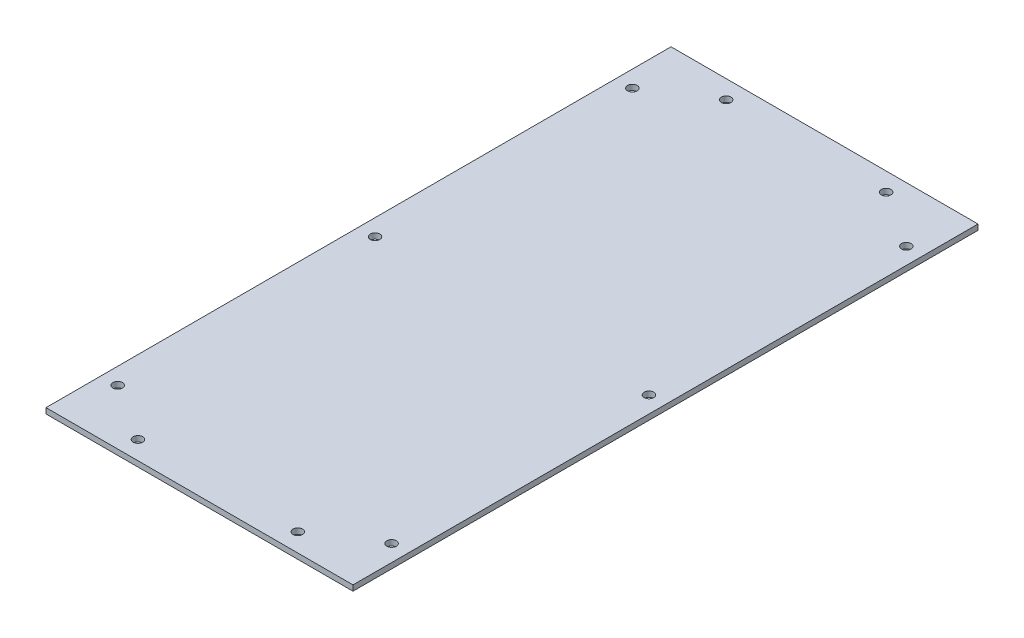
ISO-10303-21;
HEADER;
FILE_DESCRIPTION(('STEP AP214'),'2;1');
FILE_NAME('part.step','',(''),(''),'','','');
FILE_SCHEMA(('AUTOMOTIVE_DESIGN { 1 0 10303 214 1 1 1 1 }'));
ENDSEC;
DATA;
#1=APPLICATION_CONTEXT('core data for automotive mechanical design processes');
#2=APPLICATION_PROTOCOL_DEFINITION('international standard','automotive_design',2000,#1);
#3=PRODUCT_CONTEXT('',#1,'mechanical');
#4=PRODUCT('Part','Part','',(#3));
#5=PRODUCT_RELATED_PRODUCT_CATEGORY('part','',(#4));
#6=PRODUCT_DEFINITION_FORMATION('','',#4);
#7=PRODUCT_DEFINITION_CONTEXT('part definition',#1,'design');
#8=PRODUCT_DEFINITION('design','',#6,#7);
#9=PRODUCT_DEFINITION_SHAPE('','',#8);
#10=(LENGTH_UNIT() NAMED_UNIT(*) SI_UNIT(.MILLI.,.METRE.));
#11=(NAMED_UNIT(*) PLANE_ANGLE_UNIT() SI_UNIT($,.RADIAN.));
#12=(NAMED_UNIT(*) SI_UNIT($,.STERADIAN.) SOLID_ANGLE_UNIT());
#13=UNCERTAINTY_MEASURE_WITH_UNIT(LENGTH_MEASURE(1.E-05),#10,'distance_accuracy_value','');
#14=(GEOMETRIC_REPRESENTATION_CONTEXT(3) GLOBAL_UNCERTAINTY_ASSIGNED_CONTEXT((#13)) GLOBAL_UNIT_ASSIGNED_CONTEXT((#10,
#11,#12)) REPRESENTATION_CONTEXT('',''));
#15=CARTESIAN_POINT('',(0.,0.,0.));
#16=DIRECTION('',(0.,0.,1.));
#17=DIRECTION('',(1.,0.,0.));
#18=AXIS2_PLACEMENT_3D('',#15,#16,#17);
#19=CARTESIAN_POINT('',(0.,3.,0.));
#20=DIRECTION('',(0.,1.,0.));
#21=DIRECTION('',(0.,0.,1.));
#22=AXIS2_PLACEMENT_3D('',#19,#20,#21);
#23=PLANE('',#22);
#24=CARTESIAN_POINT('',(-43.5,3.,160.));
#25=DIRECTION('',(0.,1.,0.));
#26=DIRECTION('',(0.,0.,1.));
#27=AXIS2_PLACEMENT_3D('',#24,#25,#26);
#28=CIRCLE('',#27,2.59999999999998);
#29=CARTESIAN_POINT('',(-43.5,3.,162.6));
#30=VERTEX_POINT('',#29);
#31=EDGE_CURVE('E161',#30,#30,#28,.T.);
#32=ORIENTED_EDGE('',*,*,#31,.F.);
#33=EDGE_LOOP('',(#32));
#34=FACE_BOUND('',#33,.T.);
#35=CARTESIAN_POINT('',(-43.5,3.,-160.));
#36=DIRECTION('',(0.,1.,0.));
#37=DIRECTION('',(0.,0.,1.));
#38=AXIS2_PLACEMENT_3D('',#35,#36,#37);
#39=CIRCLE('',#38,2.59999999999997);
#40=CARTESIAN_POINT('',(-43.5,3.,-157.4));
#41=VERTEX_POINT('',#40);
#42=EDGE_CURVE('E149',#41,#41,#39,.T.);
#43=ORIENTED_EDGE('',*,*,#42,.F.);
#44=EDGE_LOOP('',(#43));
#45=FACE_BOUND('',#44,.T.);
#46=CARTESIAN_POINT('',(74.5000000000001,3.,0.));
#47=DIRECTION('',(0.,1.,0.));
#48=DIRECTION('',(0.,0.,1.));
#49=AXIS2_PLACEMENT_3D('',#46,#47,#48);
#50=CIRCLE('',#49,2.6);
#51=CARTESIAN_POINT('',(74.5000000000001,3.,2.6));
#52=VERTEX_POINT('',#51);
#53=EDGE_CURVE('E137',#52,#52,#50,.T.);
#54=ORIENTED_EDGE('',*,*,#53,.F.);
#55=EDGE_LOOP('',(#54));
#56=FACE_BOUND('',#55,.T.);
#57=CARTESIAN_POINT('',(-74.5,3.,140.));
#58=DIRECTION('',(0.,1.,0.));
#59=DIRECTION('',(0.,0.,1.));
#60=AXIS2_PLACEMENT_3D('',#57,#58,#59);
#61=CIRCLE('',#60,2.6);
#62=CARTESIAN_POINT('',(-74.5,3.,142.6));
#63=VERTEX_POINT('',#62);
#64=EDGE_CURVE('E125',#63,#63,#61,.T.);
#65=ORIENTED_EDGE('',*,*,#64,.F.);
#66=EDGE_LOOP('',(#65));
#67=FACE_BOUND('',#66,.T.);
#68=CARTESIAN_POINT('',(-74.5000000000001,3.,-140.));
#69=DIRECTION('',(0.,1.,0.));
#70=DIRECTION('',(0.,0.,1.));
#71=AXIS2_PLACEMENT_3D('',#68,#69,#70);
#72=CIRCLE('',#71,2.6);
#73=CARTESIAN_POINT('',(-74.5000000000001,3.,-137.4));
#74=VERTEX_POINT('',#73);
#75=EDGE_CURVE('E104',#74,#74,#72,.T.);
#76=ORIENTED_EDGE('',*,*,#75,.F.);
#77=EDGE_LOOP('',(#76));
#78=FACE_BOUND('',#77,.T.);
#79=DIRECTION('',(0.,0.,1.));
#80=VECTOR('',#79,1.);
#81=CARTESIAN_POINT('',(-83.5,3.,-170.));
#82=LINE('',#81,#80);
#83=CARTESIAN_POINT('',(-83.5,3.,-170.));
#84=VERTEX_POINT('',#83);
#85=CARTESIAN_POINT('',(-83.5,3.,170.));
#86=VERTEX_POINT('',#85);
#87=EDGE_CURVE('E89',#84,#86,#82,.T.);
#88=ORIENTED_EDGE('',*,*,#87,.T.);
#89=DIRECTION('',(1.,0.,0.));
#90=VECTOR('',#89,1.);
#91=CARTESIAN_POINT('',(-83.5,3.,170.));
#92=LINE('',#91,#90);
#93=CARTESIAN_POINT('',(83.5,3.,170.));
#94=VERTEX_POINT('',#93);
#95=EDGE_CURVE('E84',#86,#94,#92,.T.);
#96=ORIENTED_EDGE('',*,*,#95,.T.);
#97=DIRECTION('',(0.,0.,-1.));
#98=VECTOR('',#97,1.);
#99=CARTESIAN_POINT('',(83.5,3.,-170.));
#100=LINE('',#99,#98);
#101=CARTESIAN_POINT('',(83.5,3.,-170.));
#102=VERTEX_POINT('',#101);
#103=EDGE_CURVE('E87',#94,#102,#100,.T.);
#104=ORIENTED_EDGE('',*,*,#103,.T.);
#105=DIRECTION('',(-1.,0.,0.));
#106=VECTOR('',#105,1.);
#107=CARTESIAN_POINT('',(-83.5,3.,-170.));
#108=LINE('',#107,#106);
#109=EDGE_CURVE('E54',#102,#84,#108,.T.);
#110=ORIENTED_EDGE('',*,*,#109,.T.);
#111=EDGE_LOOP('',(#88,#96,#104,#110));
#112=FACE_BOUND('',#111,.T.);
#113=CARTESIAN_POINT('',(-74.5,3.,0.));
#114=DIRECTION('',(0.,1.,0.));
#115=DIRECTION('',(0.,0.,1.));
#116=AXIS2_PLACEMENT_3D('',#113,#114,#115);
#117=CIRCLE('',#116,2.6);
#118=CARTESIAN_POINT('',(-74.5,3.,2.6));
#119=VERTEX_POINT('',#118);
#120=EDGE_CURVE('E119',#119,#119,#117,.T.);
#121=ORIENTED_EDGE('',*,*,#120,.F.);
#122=EDGE_LOOP('',(#121));
#123=FACE_BOUND('',#122,.T.);
#124=CARTESIAN_POINT('',(74.5000000000001,3.,-140.));
#125=DIRECTION('',(0.,1.,0.));
#126=DIRECTION('',(0.,0.,1.));
#127=AXIS2_PLACEMENT_3D('',#124,#125,#126);
#128=CIRCLE('',#127,2.6);
#129=CARTESIAN_POINT('',(74.5000000000001,3.,-137.4));
#130=VERTEX_POINT('',#129);
#131=EDGE_CURVE('E131',#130,#130,#128,.T.);
#132=ORIENTED_EDGE('',*,*,#131,.F.);
#133=EDGE_LOOP('',(#132));
#134=FACE_BOUND('',#133,.T.);
#135=CARTESIAN_POINT('',(74.5000000000001,3.,140.));
#136=DIRECTION('',(0.,1.,0.));
#137=DIRECTION('',(0.,0.,1.));
#138=AXIS2_PLACEMENT_3D('',#135,#136,#137);
#139=CIRCLE('',#138,2.6);
#140=CARTESIAN_POINT('',(74.5000000000001,3.,142.6));
#141=VERTEX_POINT('',#140);
#142=EDGE_CURVE('E143',#141,#141,#139,.T.);
#143=ORIENTED_EDGE('',*,*,#142,.F.);
#144=EDGE_LOOP('',(#143));
#145=FACE_BOUND('',#144,.T.);
#146=CARTESIAN_POINT('',(43.5000000000001,3.,-160.));
#147=DIRECTION('',(0.,1.,0.));
#148=DIRECTION('',(0.,0.,1.));
#149=AXIS2_PLACEMENT_3D('',#146,#147,#148);
#150=CIRCLE('',#149,2.59999999999997);
#151=CARTESIAN_POINT('',(43.5000000000001,3.,-157.4));
#152=VERTEX_POINT('',#151);
#153=EDGE_CURVE('E155',#152,#152,#150,.T.);
#154=ORIENTED_EDGE('',*,*,#153,.F.);
#155=EDGE_LOOP('',(#154));
#156=FACE_BOUND('',#155,.T.);
#157=CARTESIAN_POINT('',(43.5000000000001,3.,160.));
#158=DIRECTION('',(0.,1.,0.));
#159=DIRECTION('',(0.,0.,1.));
#160=AXIS2_PLACEMENT_3D('',#157,#158,#159);
#161=CIRCLE('',#160,2.59999999999997);
#162=CARTESIAN_POINT('',(43.5000000000001,3.,162.6));
#163=VERTEX_POINT('',#162);
#164=EDGE_CURVE('E167',#163,#163,#161,.T.);
#165=ORIENTED_EDGE('',*,*,#164,.F.);
#166=EDGE_LOOP('',(#165));
#167=FACE_BOUND('',#166,.T.);
#168=ADVANCED_FACE('F37',(#34,#45,#56,#67,#78,#112,#123,#134,#145,#156,#167),#23,.T.);
#169=CARTESIAN_POINT('',(0.,0.,0.));
#170=DIRECTION('',(0.,1.,0.));
#171=DIRECTION('',(0.,0.,1.));
#172=AXIS2_PLACEMENT_3D('',#169,#170,#171);
#173=PLANE('',#172);
#174=DIRECTION('',(0.,0.,1.));
#175=VECTOR('',#174,1.);
#176=CARTESIAN_POINT('',(-83.5,0.,-170.));
#177=LINE('',#176,#175);
#178=CARTESIAN_POINT('',(-83.5,0.,-170.));
#179=VERTEX_POINT('',#178);
#180=CARTESIAN_POINT('',(-83.5,0.,170.));
#181=VERTEX_POINT('',#180);
#182=EDGE_CURVE('E101',#179,#181,#177,.T.);
#183=ORIENTED_EDGE('',*,*,#182,.F.);
#184=DIRECTION('',(-1.,0.,0.));
#185=VECTOR('',#184,1.);
#186=CARTESIAN_POINT('',(-83.5,0.,-170.));
#187=LINE('',#186,#185);
#188=CARTESIAN_POINT('',(83.5,0.,-170.));
#189=VERTEX_POINT('',#188);
#190=EDGE_CURVE('E77',#189,#179,#187,.T.);
#191=ORIENTED_EDGE('',*,*,#190,.F.);
#192=DIRECTION('',(0.,0.,-1.));
#193=VECTOR('',#192,1.);
#194=CARTESIAN_POINT('',(83.5,0.,-170.));
#195=LINE('',#194,#193);
#196=CARTESIAN_POINT('',(83.5,0.,170.));
#197=VERTEX_POINT('',#196);
#198=EDGE_CURVE('E71',#197,#189,#195,.T.);
#199=ORIENTED_EDGE('',*,*,#198,.F.);
#200=DIRECTION('',(1.,0.,0.));
#201=VECTOR('',#200,1.);
#202=CARTESIAN_POINT('',(-83.5,0.,170.));
#203=LINE('',#202,#201);
#204=EDGE_CURVE('E93',#181,#197,#203,.T.);
#205=ORIENTED_EDGE('',*,*,#204,.F.);
#206=EDGE_LOOP('',(#183,#191,#199,#205));
#207=FACE_BOUND('',#206,.T.);
#208=CARTESIAN_POINT('',(-74.5000000000001,0.,-140.));
#209=DIRECTION('',(0.,1.,0.));
#210=DIRECTION('',(0.,0.,1.));
#211=AXIS2_PLACEMENT_3D('',#208,#209,#210);
#212=CIRCLE('',#211,2.6);
#213=CARTESIAN_POINT('',(-74.5000000000001,0.,-137.4));
#214=VERTEX_POINT('',#213);
#215=EDGE_CURVE('E116',#214,#214,#212,.T.);
#216=ORIENTED_EDGE('',*,*,#215,.T.);
#217=EDGE_LOOP('',(#216));
#218=FACE_BOUND('',#217,.T.);
#219=CARTESIAN_POINT('',(-74.5,0.,0.));
#220=DIRECTION('',(0.,1.,0.));
#221=DIRECTION('',(0.,0.,1.));
#222=AXIS2_PLACEMENT_3D('',#219,#220,#221);
#223=CIRCLE('',#222,2.6);
#224=CARTESIAN_POINT('',(-74.5,0.,2.6));
#225=VERTEX_POINT('',#224);
#226=EDGE_CURVE('E122',#225,#225,#223,.T.);
#227=ORIENTED_EDGE('',*,*,#226,.T.);
#228=EDGE_LOOP('',(#227));
#229=FACE_BOUND('',#228,.T.);
#230=CARTESIAN_POINT('',(-74.5,0.,140.));
#231=DIRECTION('',(0.,1.,0.));
#232=DIRECTION('',(0.,0.,1.));
#233=AXIS2_PLACEMENT_3D('',#230,#231,#232);
#234=CIRCLE('',#233,2.6);
#235=CARTESIAN_POINT('',(-74.5,0.,142.6));
#236=VERTEX_POINT('',#235);
#237=EDGE_CURVE('E128',#236,#236,#234,.T.);
#238=ORIENTED_EDGE('',*,*,#237,.T.);
#239=EDGE_LOOP('',(#238));
#240=FACE_BOUND('',#239,.T.);
#241=CARTESIAN_POINT('',(74.5000000000001,0.,-140.));
#242=DIRECTION('',(0.,1.,0.));
#243=DIRECTION('',(0.,0.,1.));
#244=AXIS2_PLACEMENT_3D('',#241,#242,#243);
#245=CIRCLE('',#244,2.6);
#246=CARTESIAN_POINT('',(74.5000000000001,0.,-137.4));
#247=VERTEX_POINT('',#246);
#248=EDGE_CURVE('E134',#247,#247,#245,.T.);
#249=ORIENTED_EDGE('',*,*,#248,.T.);
#250=EDGE_LOOP('',(#249));
#251=FACE_BOUND('',#250,.T.);
#252=CARTESIAN_POINT('',(74.5000000000001,0.,0.));
#253=DIRECTION('',(0.,1.,0.));
#254=DIRECTION('',(0.,0.,1.));
#255=AXIS2_PLACEMENT_3D('',#252,#253,#254);
#256=CIRCLE('',#255,2.6);
#257=CARTESIAN_POINT('',(74.5000000000001,0.,2.6));
#258=VERTEX_POINT('',#257);
#259=EDGE_CURVE('E140',#258,#258,#256,.T.);
#260=ORIENTED_EDGE('',*,*,#259,.T.);
#261=EDGE_LOOP('',(#260));
#262=FACE_BOUND('',#261,.T.);
#263=CARTESIAN_POINT('',(74.5000000000001,0.,140.));
#264=DIRECTION('',(0.,1.,0.));
#265=DIRECTION('',(0.,0.,1.));
#266=AXIS2_PLACEMENT_3D('',#263,#264,#265);
#267=CIRCLE('',#266,2.6);
#268=CARTESIAN_POINT('',(74.5000000000001,0.,142.6));
#269=VERTEX_POINT('',#268);
#270=EDGE_CURVE('E146',#269,#269,#267,.T.);
#271=ORIENTED_EDGE('',*,*,#270,.T.);
#272=EDGE_LOOP('',(#271));
#273=FACE_BOUND('',#272,.T.);
#274=CARTESIAN_POINT('',(-43.5,0.,-160.));
#275=DIRECTION('',(0.,1.,0.));
#276=DIRECTION('',(0.,0.,1.));
#277=AXIS2_PLACEMENT_3D('',#274,#275,#276);
#278=CIRCLE('',#277,2.59999999999997);
#279=CARTESIAN_POINT('',(-43.5,0.,-157.4));
#280=VERTEX_POINT('',#279);
#281=EDGE_CURVE('E152',#280,#280,#278,.T.);
#282=ORIENTED_EDGE('',*,*,#281,.T.);
#283=EDGE_LOOP('',(#282));
#284=FACE_BOUND('',#283,.T.);
#285=CARTESIAN_POINT('',(43.5000000000001,0.,-160.));
#286=DIRECTION('',(0.,1.,0.));
#287=DIRECTION('',(0.,0.,1.));
#288=AXIS2_PLACEMENT_3D('',#285,#286,#287);
#289=CIRCLE('',#288,2.59999999999997);
#290=CARTESIAN_POINT('',(43.5000000000001,0.,-157.4));
#291=VERTEX_POINT('',#290);
#292=EDGE_CURVE('E158',#291,#291,#289,.T.);
#293=ORIENTED_EDGE('',*,*,#292,.T.);
#294=EDGE_LOOP('',(#293));
#295=FACE_BOUND('',#294,.T.);
#296=CARTESIAN_POINT('',(-43.5,0.,160.));
#297=DIRECTION('',(0.,1.,0.));
#298=DIRECTION('',(0.,0.,1.));
#299=AXIS2_PLACEMENT_3D('',#296,#297,#298);
#300=CIRCLE('',#299,2.59999999999998);
#301=CARTESIAN_POINT('',(-43.5,0.,162.6));
#302=VERTEX_POINT('',#301);
#303=EDGE_CURVE('E164',#302,#302,#300,.T.);
#304=ORIENTED_EDGE('',*,*,#303,.T.);
#305=EDGE_LOOP('',(#304));
#306=FACE_BOUND('',#305,.T.);
#307=CARTESIAN_POINT('',(43.5000000000001,0.,160.));
#308=DIRECTION('',(0.,1.,0.));
#309=DIRECTION('',(0.,0.,1.));
#310=AXIS2_PLACEMENT_3D('',#307,#308,#309);
#311=CIRCLE('',#310,2.59999999999997);
#312=CARTESIAN_POINT('',(43.5000000000001,0.,162.6));
#313=VERTEX_POINT('',#312);
#314=EDGE_CURVE('E170',#313,#313,#311,.T.);
#315=ORIENTED_EDGE('',*,*,#314,.T.);
#316=EDGE_LOOP('',(#315));
#317=FACE_BOUND('',#316,.T.);
#318=ADVANCED_FACE('F112',(#207,#218,#229,#240,#251,#262,#273,#284,#295,#306,#317),#173,.F.);
#319=CARTESIAN_POINT('',(-83.5,3.,-170.));
#320=DIRECTION('',(1.,0.,0.));
#321=DIRECTION('',(0.,0.,-1.));
#322=AXIS2_PLACEMENT_3D('',#319,#320,#321);
#323=PLANE('',#322);
#324=ORIENTED_EDGE('',*,*,#182,.T.);
#325=DIRECTION('',(0.,-1.,0.));
#326=VECTOR('',#325,1.);
#327=CARTESIAN_POINT('',(-83.5,3.,170.));
#328=LINE('',#327,#326);
#329=EDGE_CURVE('E11',#86,#181,#328,.T.);
#330=ORIENTED_EDGE('',*,*,#329,.F.);
#331=ORIENTED_EDGE('',*,*,#87,.F.);
#332=DIRECTION('',(0.,-1.,0.));
#333=VECTOR('',#332,1.);
#334=CARTESIAN_POINT('',(-83.5,3.,-170.));
#335=LINE('',#334,#333);
#336=EDGE_CURVE('E97',#84,#179,#335,.T.);
#337=ORIENTED_EDGE('',*,*,#336,.T.);
#338=EDGE_LOOP('',(#324,#330,#331,#337));
#339=FACE_BOUND('',#338,.T.);
#340=ADVANCED_FACE('F39',(#339),#323,.F.);
#341=CARTESIAN_POINT('',(-83.5,3.,170.));
#342=DIRECTION('',(0.,0.,-1.));
#343=DIRECTION('',(-1.,0.,0.));
#344=AXIS2_PLACEMENT_3D('',#341,#342,#343);
#345=PLANE('',#344);
#346=ORIENTED_EDGE('',*,*,#204,.T.);
#347=DIRECTION('',(0.,-1.,0.));
#348=VECTOR('',#347,1.);
#349=CARTESIAN_POINT('',(83.5,3.,170.));
#350=LINE('',#349,#348);
#351=EDGE_CURVE('E46',#94,#197,#350,.T.);
#352=ORIENTED_EDGE('',*,*,#351,.F.);
#353=ORIENTED_EDGE('',*,*,#95,.F.);
#354=ORIENTED_EDGE('',*,*,#329,.T.);
#355=EDGE_LOOP('',(#346,#352,#353,#354));
#356=FACE_BOUND('',#355,.T.);
#357=ADVANCED_FACE('F92',(#356),#345,.F.);
#358=CARTESIAN_POINT('',(83.5,3.,-170.));
#359=DIRECTION('',(-1.,0.,0.));
#360=DIRECTION('',(0.,0.,1.));
#361=AXIS2_PLACEMENT_3D('',#358,#359,#360);
#362=PLANE('',#361);
#363=ORIENTED_EDGE('',*,*,#198,.T.);
#364=DIRECTION('',(0.,-1.,0.));
#365=VECTOR('',#364,1.);
#366=CARTESIAN_POINT('',(83.5,3.,-170.));
#367=LINE('',#366,#365);
#368=EDGE_CURVE('E94',#102,#189,#367,.T.);
#369=ORIENTED_EDGE('',*,*,#368,.F.);
#370=ORIENTED_EDGE('',*,*,#103,.F.);
#371=ORIENTED_EDGE('',*,*,#351,.T.);
#372=EDGE_LOOP('',(#363,#369,#370,#371));
#373=FACE_BOUND('',#372,.T.);
#374=ADVANCED_FACE('F95',(#373),#362,.F.);
#375=CARTESIAN_POINT('',(-83.5,3.,-170.));
#376=DIRECTION('',(0.,0.,1.));
#377=DIRECTION('',(1.,0.,0.));
#378=AXIS2_PLACEMENT_3D('',#375,#376,#377);
#379=PLANE('',#378);
#380=ORIENTED_EDGE('',*,*,#190,.T.);
#381=ORIENTED_EDGE('',*,*,#336,.F.);
#382=ORIENTED_EDGE('',*,*,#109,.F.);
#383=ORIENTED_EDGE('',*,*,#368,.T.);
#384=EDGE_LOOP('',(#380,#381,#382,#383));
#385=FACE_BOUND('',#384,.T.);
#386=ADVANCED_FACE('F109',(#385),#379,.F.);
#387=CARTESIAN_POINT('',(-74.5000000000001,3.,-140.));
#388=DIRECTION('',(0.,-1.,0.));
#389=DIRECTION('',(0.,0.,-1.));
#390=AXIS2_PLACEMENT_3D('',#387,#388,#389);
#391=CYLINDRICAL_SURFACE('',#390,2.6);
#392=ORIENTED_EDGE('',*,*,#75,.T.);
#393=EDGE_LOOP('',(#392));
#394=FACE_BOUND('',#393,.T.);
#395=ORIENTED_EDGE('',*,*,#215,.F.);
#396=EDGE_LOOP('',(#395));
#397=FACE_BOUND('',#396,.T.);
#398=ADVANCED_FACE('F189',(#394,#397),#391,.F.);
#399=CARTESIAN_POINT('',(-74.5,3.,0.));
#400=DIRECTION('',(0.,-1.,0.));
#401=DIRECTION('',(0.,0.,-1.));
#402=AXIS2_PLACEMENT_3D('',#399,#400,#401);
#403=CYLINDRICAL_SURFACE('',#402,2.6);
#404=ORIENTED_EDGE('',*,*,#120,.T.);
#405=EDGE_LOOP('',(#404));
#406=FACE_BOUND('',#405,.T.);
#407=ORIENTED_EDGE('',*,*,#226,.F.);
#408=EDGE_LOOP('',(#407));
#409=FACE_BOUND('',#408,.T.);
#410=ADVANCED_FACE('F243',(#406,#409),#403,.F.);
#411=CARTESIAN_POINT('',(-74.5,3.,140.));
#412=DIRECTION('',(0.,-1.,0.));
#413=DIRECTION('',(0.,0.,-1.));
#414=AXIS2_PLACEMENT_3D('',#411,#412,#413);
#415=CYLINDRICAL_SURFACE('',#414,2.6);
#416=ORIENTED_EDGE('',*,*,#64,.T.);
#417=EDGE_LOOP('',(#416));
#418=FACE_BOUND('',#417,.T.);
#419=ORIENTED_EDGE('',*,*,#237,.F.);
#420=EDGE_LOOP('',(#419));
#421=FACE_BOUND('',#420,.T.);
#422=ADVANCED_FACE('F252',(#418,#421),#415,.F.);
#423=CARTESIAN_POINT('',(74.5000000000001,3.,-140.));
#424=DIRECTION('',(0.,-1.,0.));
#425=DIRECTION('',(0.,0.,-1.));
#426=AXIS2_PLACEMENT_3D('',#423,#424,#425);
#427=CYLINDRICAL_SURFACE('',#426,2.6);
#428=ORIENTED_EDGE('',*,*,#131,.T.);
#429=EDGE_LOOP('',(#428));
#430=FACE_BOUND('',#429,.T.);
#431=ORIENTED_EDGE('',*,*,#248,.F.);
#432=EDGE_LOOP('',(#431));
#433=FACE_BOUND('',#432,.T.);
#434=ADVANCED_FACE('F261',(#430,#433),#427,.F.);
#435=CARTESIAN_POINT('',(74.5000000000001,3.,0.));
#436=DIRECTION('',(0.,-1.,0.));
#437=DIRECTION('',(0.,0.,-1.));
#438=AXIS2_PLACEMENT_3D('',#435,#436,#437);
#439=CYLINDRICAL_SURFACE('',#438,2.6);
#440=ORIENTED_EDGE('',*,*,#53,.T.);
#441=EDGE_LOOP('',(#440));
#442=FACE_BOUND('',#441,.T.);
#443=ORIENTED_EDGE('',*,*,#259,.F.);
#444=EDGE_LOOP('',(#443));
#445=FACE_BOUND('',#444,.T.);
#446=ADVANCED_FACE('F271',(#442,#445),#439,.F.);
#447=CARTESIAN_POINT('',(74.5000000000001,3.,140.));
#448=DIRECTION('',(0.,-1.,0.));
#449=DIRECTION('',(0.,0.,-1.));
#450=AXIS2_PLACEMENT_3D('',#447,#448,#449);
#451=CYLINDRICAL_SURFACE('',#450,2.6);
#452=ORIENTED_EDGE('',*,*,#142,.T.);
#453=EDGE_LOOP('',(#452));
#454=FACE_BOUND('',#453,.T.);
#455=ORIENTED_EDGE('',*,*,#270,.F.);
#456=EDGE_LOOP('',(#455));
#457=FACE_BOUND('',#456,.T.);
#458=ADVANCED_FACE('F281',(#454,#457),#451,.F.);
#459=CARTESIAN_POINT('',(-43.5,3.,-160.));
#460=DIRECTION('',(0.,-1.,0.));
#461=DIRECTION('',(0.,0.,-1.));
#462=AXIS2_PLACEMENT_3D('',#459,#460,#461);
#463=CYLINDRICAL_SURFACE('',#462,2.59999999999997);
#464=ORIENTED_EDGE('',*,*,#42,.T.);
#465=EDGE_LOOP('',(#464));
#466=FACE_BOUND('',#465,.T.);
#467=ORIENTED_EDGE('',*,*,#281,.F.);
#468=EDGE_LOOP('',(#467));
#469=FACE_BOUND('',#468,.T.);
#470=ADVANCED_FACE('F291',(#466,#469),#463,.F.);
#471=CARTESIAN_POINT('',(43.5000000000001,3.,-160.));
#472=DIRECTION('',(0.,-1.,0.));
#473=DIRECTION('',(0.,0.,-1.));
#474=AXIS2_PLACEMENT_3D('',#471,#472,#473);
#475=CYLINDRICAL_SURFACE('',#474,2.59999999999997);
#476=ORIENTED_EDGE('',*,*,#153,.T.);
#477=EDGE_LOOP('',(#476));
#478=FACE_BOUND('',#477,.T.);
#479=ORIENTED_EDGE('',*,*,#292,.F.);
#480=EDGE_LOOP('',(#479));
#481=FACE_BOUND('',#480,.T.);
#482=ADVANCED_FACE('F301',(#478,#481),#475,.F.);
#483=CARTESIAN_POINT('',(-43.5,3.,160.));
#484=DIRECTION('',(0.,-1.,0.));
#485=DIRECTION('',(0.,0.,-1.));
#486=AXIS2_PLACEMENT_3D('',#483,#484,#485);
#487=CYLINDRICAL_SURFACE('',#486,2.59999999999998);
#488=ORIENTED_EDGE('',*,*,#31,.T.);
#489=EDGE_LOOP('',(#488));
#490=FACE_BOUND('',#489,.T.);
#491=ORIENTED_EDGE('',*,*,#303,.F.);
#492=EDGE_LOOP('',(#491));
#493=FACE_BOUND('',#492,.T.);
#494=ADVANCED_FACE('F311',(#490,#493),#487,.F.);
#495=CARTESIAN_POINT('',(43.5000000000001,3.,160.));
#496=DIRECTION('',(0.,-1.,0.));
#497=DIRECTION('',(0.,0.,-1.));
#498=AXIS2_PLACEMENT_3D('',#495,#496,#497);
#499=CYLINDRICAL_SURFACE('',#498,2.59999999999997);
#500=ORIENTED_EDGE('',*,*,#164,.T.);
#501=EDGE_LOOP('',(#500));
#502=FACE_BOUND('',#501,.T.);
#503=ORIENTED_EDGE('',*,*,#314,.F.);
#504=EDGE_LOOP('',(#503));
#505=FACE_BOUND('',#504,.T.);
#506=ADVANCED_FACE('F176',(#502,#505),#499,.F.);
#507=CLOSED_SHELL('',(#168,#318,#340,#357,#374,#386,#398,#410,#422,#434,#446,#458,#470,#482,
#494,#506));
#508=MANIFOLD_SOLID_BREP('B2',#507);
#509=ADVANCED_BREP_SHAPE_REPRESENTATION('',(#18,#508),#14);
#510=SHAPE_DEFINITION_REPRESENTATION(#9,#509);
ENDSEC;
END-ISO-10303-21;
